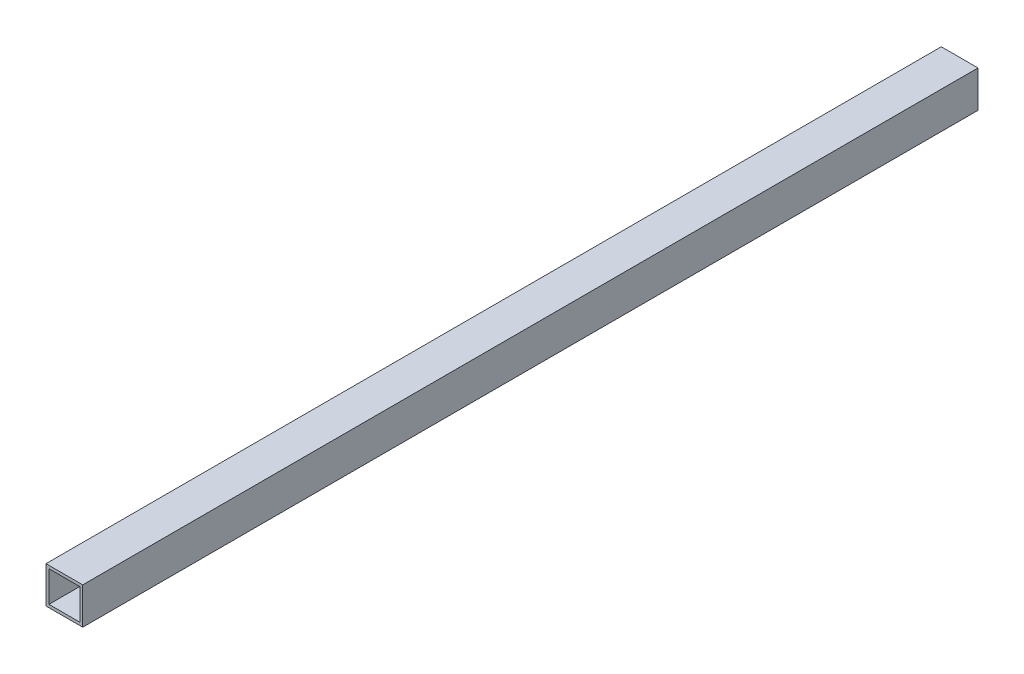
ISO-10303-21;
HEADER;
FILE_DESCRIPTION(('STEP AP214'),'2;1');
FILE_NAME('part.step','',(''),(''),'','','');
FILE_SCHEMA(('AUTOMOTIVE_DESIGN { 1 0 10303 214 1 1 1 1 }'));
ENDSEC;
DATA;
#1=APPLICATION_CONTEXT('core data for automotive mechanical design processes');
#2=APPLICATION_PROTOCOL_DEFINITION('international standard','automotive_design',2000,#1);
#3=PRODUCT_CONTEXT('',#1,'mechanical');
#4=PRODUCT('Part','Part','',(#3));
#5=PRODUCT_RELATED_PRODUCT_CATEGORY('part','',(#4));
#6=PRODUCT_DEFINITION_FORMATION('','',#4);
#7=PRODUCT_DEFINITION_CONTEXT('part definition',#1,'design');
#8=PRODUCT_DEFINITION('design','',#6,#7);
#9=PRODUCT_DEFINITION_SHAPE('','',#8);
#10=(LENGTH_UNIT() NAMED_UNIT(*) SI_UNIT(.MILLI.,.METRE.));
#11=(NAMED_UNIT(*) PLANE_ANGLE_UNIT() SI_UNIT($,.RADIAN.));
#12=(NAMED_UNIT(*) SI_UNIT($,.STERADIAN.) SOLID_ANGLE_UNIT());
#13=UNCERTAINTY_MEASURE_WITH_UNIT(LENGTH_MEASURE(1.E-05),#10,'distance_accuracy_value','');
#14=(GEOMETRIC_REPRESENTATION_CONTEXT(3) GLOBAL_UNCERTAINTY_ASSIGNED_CONTEXT((#13)) GLOBAL_UNIT_ASSIGNED_CONTEXT((#10,
#11,#12)) REPRESENTATION_CONTEXT('',''));
#15=CARTESIAN_POINT('',(0.,0.,0.));
#16=DIRECTION('',(0.,0.,1.));
#17=DIRECTION('',(1.,0.,0.));
#18=AXIS2_PLACEMENT_3D('',#15,#16,#17);
#19=CARTESIAN_POINT('',(0.,0.,304.8));
#20=DIRECTION('',(0.,0.,1.));
#21=DIRECTION('',(1.,0.,0.));
#22=AXIS2_PLACEMENT_3D('',#19,#20,#21);
#23=PLANE('',#22);
#24=DIRECTION('',(0.,1.,0.));
#25=VECTOR('',#24,1.);
#26=CARTESIAN_POINT('',(12.5,-12.5,304.8));
#27=LINE('',#26,#25);
#28=CARTESIAN_POINT('',(12.5,-12.5,304.8));
#29=VERTEX_POINT('',#28);
#30=CARTESIAN_POINT('',(12.5,12.5,304.8));
#31=VERTEX_POINT('',#30);
#32=EDGE_CURVE('E108',#29,#31,#27,.T.);
#33=ORIENTED_EDGE('',*,*,#32,.T.);
#34=DIRECTION('',(-1.,0.,0.));
#35=VECTOR('',#34,1.);
#36=CARTESIAN_POINT('',(12.5,12.5,304.8));
#37=LINE('',#36,#35);
#38=CARTESIAN_POINT('',(-12.5,12.5,304.8));
#39=VERTEX_POINT('',#38);
#40=EDGE_CURVE('E151',#31,#39,#37,.T.);
#41=ORIENTED_EDGE('',*,*,#40,.T.);
#42=DIRECTION('',(0.,-1.,0.));
#43=VECTOR('',#42,1.);
#44=CARTESIAN_POINT('',(-12.5,-12.5,304.8));
#45=LINE('',#44,#43);
#46=CARTESIAN_POINT('',(-12.5,-12.5,304.8));
#47=VERTEX_POINT('',#46);
#48=EDGE_CURVE('E153',#39,#47,#45,.T.);
#49=ORIENTED_EDGE('',*,*,#48,.T.);
#50=DIRECTION('',(1.,0.,0.));
#51=VECTOR('',#50,1.);
#52=CARTESIAN_POINT('',(12.5,-12.5,304.8));
#53=LINE('',#52,#51);
#54=EDGE_CURVE('E55',#47,#29,#53,.T.);
#55=ORIENTED_EDGE('',*,*,#54,.T.);
#56=EDGE_LOOP('',(#33,#41,#49,#55));
#57=FACE_BOUND('',#56,.T.);
#58=DIRECTION('',(-1.,0.,0.));
#59=VECTOR('',#58,1.);
#60=CARTESIAN_POINT('',(10.5,10.5,304.8));
#61=LINE('',#60,#59);
#62=CARTESIAN_POINT('',(10.5,10.5,304.8));
#63=VERTEX_POINT('',#62);
#64=CARTESIAN_POINT('',(-10.5,10.5,304.8));
#65=VERTEX_POINT('',#64);
#66=EDGE_CURVE('E140',#63,#65,#61,.T.);
#67=ORIENTED_EDGE('',*,*,#66,.F.);
#68=DIRECTION('',(0.,1.,0.));
#69=VECTOR('',#68,1.);
#70=CARTESIAN_POINT('',(10.5,-10.5,304.8));
#71=LINE('',#70,#69);
#72=CARTESIAN_POINT('',(10.5,-10.5,304.8));
#73=VERTEX_POINT('',#72);
#74=EDGE_CURVE('E105',#73,#63,#71,.T.);
#75=ORIENTED_EDGE('',*,*,#74,.F.);
#76=DIRECTION('',(1.,0.,0.));
#77=VECTOR('',#76,1.);
#78=CARTESIAN_POINT('',(10.5,-10.5,304.8));
#79=LINE('',#78,#77);
#80=CARTESIAN_POINT('',(-10.5,-10.5,304.8));
#81=VERTEX_POINT('',#80);
#82=EDGE_CURVE('E144',#81,#73,#79,.T.);
#83=ORIENTED_EDGE('',*,*,#82,.F.);
#84=DIRECTION('',(0.,-1.,0.));
#85=VECTOR('',#84,1.);
#86=CARTESIAN_POINT('',(-10.5,-10.5,304.8));
#87=LINE('',#86,#85);
#88=EDGE_CURVE('E142',#65,#81,#87,.T.);
#89=ORIENTED_EDGE('',*,*,#88,.F.);
#90=EDGE_LOOP('',(#67,#75,#83,#89));
#91=FACE_BOUND('',#90,.T.);
#92=ADVANCED_FACE('F32',(#57,#91),#23,.T.);
#93=CARTESIAN_POINT('',(12.5,-12.5,304.8));
#94=DIRECTION('',(-1.,0.,0.));
#95=DIRECTION('',(0.,0.,1.));
#96=AXIS2_PLACEMENT_3D('',#93,#94,#95);
#97=PLANE('',#96);
#98=DIRECTION('',(0.,0.,-1.));
#99=VECTOR('',#98,1.);
#100=CARTESIAN_POINT('',(12.5,-12.5,304.8));
#101=LINE('',#100,#99);
#102=CARTESIAN_POINT('',(12.5,-12.5,-304.8));
#103=VERTEX_POINT('',#102);
#104=EDGE_CURVE('E156',#29,#103,#101,.T.);
#105=ORIENTED_EDGE('',*,*,#104,.T.);
#106=DIRECTION('',(0.,1.,0.));
#107=VECTOR('',#106,1.);
#108=CARTESIAN_POINT('',(12.5,-12.5,-304.8));
#109=LINE('',#108,#107);
#110=CARTESIAN_POINT('',(12.5,12.5,-304.8));
#111=VERTEX_POINT('',#110);
#112=EDGE_CURVE('E127',#103,#111,#109,.T.);
#113=ORIENTED_EDGE('',*,*,#112,.T.);
#114=DIRECTION('',(0.,0.,-1.));
#115=VECTOR('',#114,1.);
#116=CARTESIAN_POINT('',(12.5,12.5,304.8));
#117=LINE('',#116,#115);
#118=EDGE_CURVE('E11',#31,#111,#117,.T.);
#119=ORIENTED_EDGE('',*,*,#118,.F.);
#120=ORIENTED_EDGE('',*,*,#32,.F.);
#121=EDGE_LOOP('',(#105,#113,#119,#120));
#122=FACE_BOUND('',#121,.T.);
#123=ADVANCED_FACE('F34',(#122),#97,.F.);
#124=CARTESIAN_POINT('',(12.5,12.5,304.8));
#125=DIRECTION('',(0.,-1.,0.));
#126=DIRECTION('',(1.,0.,0.));
#127=AXIS2_PLACEMENT_3D('',#124,#125,#126);
#128=PLANE('',#127);
#129=ORIENTED_EDGE('',*,*,#118,.T.);
#130=DIRECTION('',(-1.,0.,0.));
#131=VECTOR('',#130,1.);
#132=CARTESIAN_POINT('',(12.5,12.5,-304.8));
#133=LINE('',#132,#131);
#134=CARTESIAN_POINT('',(-12.5,12.5,-304.8));
#135=VERTEX_POINT('',#134);
#136=EDGE_CURVE('E130',#111,#135,#133,.T.);
#137=ORIENTED_EDGE('',*,*,#136,.T.);
#138=DIRECTION('',(0.,0.,-1.));
#139=VECTOR('',#138,1.);
#140=CARTESIAN_POINT('',(-12.5,12.5,304.8));
#141=LINE('',#140,#139);
#142=EDGE_CURVE('E40',#39,#135,#141,.T.);
#143=ORIENTED_EDGE('',*,*,#142,.F.);
#144=ORIENTED_EDGE('',*,*,#40,.F.);
#145=EDGE_LOOP('',(#129,#137,#143,#144));
#146=FACE_BOUND('',#145,.T.);
#147=ADVANCED_FACE('F169',(#146),#128,.F.);
#148=CARTESIAN_POINT('',(-12.5,-12.5,304.8));
#149=DIRECTION('',(1.,0.,0.));
#150=DIRECTION('',(0.,0.,-1.));
#151=AXIS2_PLACEMENT_3D('',#148,#149,#150);
#152=PLANE('',#151);
#153=ORIENTED_EDGE('',*,*,#142,.T.);
#154=DIRECTION('',(0.,-1.,0.));
#155=VECTOR('',#154,1.);
#156=CARTESIAN_POINT('',(-12.5,-12.5,-304.8));
#157=LINE('',#156,#155);
#158=CARTESIAN_POINT('',(-12.5,-12.5,-304.8));
#159=VERTEX_POINT('',#158);
#160=EDGE_CURVE('E133',#135,#159,#157,.T.);
#161=ORIENTED_EDGE('',*,*,#160,.T.);
#162=DIRECTION('',(0.,0.,-1.));
#163=VECTOR('',#162,1.);
#164=CARTESIAN_POINT('',(-12.5,-12.5,304.8));
#165=LINE('',#164,#163);
#166=EDGE_CURVE('E158',#47,#159,#165,.T.);
#167=ORIENTED_EDGE('',*,*,#166,.F.);
#168=ORIENTED_EDGE('',*,*,#48,.F.);
#169=EDGE_LOOP('',(#153,#161,#167,#168));
#170=FACE_BOUND('',#169,.T.);
#171=ADVANCED_FACE('F163',(#170),#152,.F.);
#172=CARTESIAN_POINT('',(12.5,-12.5,304.8));
#173=DIRECTION('',(0.,1.,0.));
#174=DIRECTION('',(-1.,0.,0.));
#175=AXIS2_PLACEMENT_3D('',#172,#173,#174);
#176=PLANE('',#175);
#177=ORIENTED_EDGE('',*,*,#166,.T.);
#178=DIRECTION('',(1.,0.,0.));
#179=VECTOR('',#178,1.);
#180=CARTESIAN_POINT('',(12.5,-12.5,-304.8));
#181=LINE('',#180,#179);
#182=EDGE_CURVE('E136',#159,#103,#181,.T.);
#183=ORIENTED_EDGE('',*,*,#182,.T.);
#184=ORIENTED_EDGE('',*,*,#104,.F.);
#185=ORIENTED_EDGE('',*,*,#54,.F.);
#186=EDGE_LOOP('',(#177,#183,#184,#185));
#187=FACE_BOUND('',#186,.T.);
#188=ADVANCED_FACE('F174',(#187),#176,.F.);
#189=CARTESIAN_POINT('',(10.5,-10.5,304.8));
#190=DIRECTION('',(-1.,0.,0.));
#191=DIRECTION('',(0.,0.,1.));
#192=AXIS2_PLACEMENT_3D('',#189,#190,#191);
#193=PLANE('',#192);
#194=DIRECTION('',(0.,0.,-1.));
#195=VECTOR('',#194,1.);
#196=CARTESIAN_POINT('',(10.5,10.5,304.8));
#197=LINE('',#196,#195);
#198=CARTESIAN_POINT('',(10.5,10.5,-304.8));
#199=VERTEX_POINT('',#198);
#200=EDGE_CURVE('E97',#63,#199,#197,.T.);
#201=ORIENTED_EDGE('',*,*,#200,.T.);
#202=DIRECTION('',(0.,1.,0.));
#203=VECTOR('',#202,1.);
#204=CARTESIAN_POINT('',(10.5,-10.5,-304.8));
#205=LINE('',#204,#203);
#206=CARTESIAN_POINT('',(10.5,-10.5,-304.8));
#207=VERTEX_POINT('',#206);
#208=EDGE_CURVE('E102',#207,#199,#205,.T.);
#209=ORIENTED_EDGE('',*,*,#208,.F.);
#210=DIRECTION('',(0.,0.,-1.));
#211=VECTOR('',#210,1.);
#212=CARTESIAN_POINT('',(10.5,-10.5,304.8));
#213=LINE('',#212,#211);
#214=EDGE_CURVE('E146',#73,#207,#213,.T.);
#215=ORIENTED_EDGE('',*,*,#214,.F.);
#216=ORIENTED_EDGE('',*,*,#74,.T.);
#217=EDGE_LOOP('',(#201,#209,#215,#216));
#218=FACE_BOUND('',#217,.T.);
#219=ADVANCED_FACE('F99',(#218),#193,.T.);
#220=CARTESIAN_POINT('',(10.5,10.5,304.8));
#221=DIRECTION('',(0.,-1.,0.));
#222=DIRECTION('',(1.,0.,0.));
#223=AXIS2_PLACEMENT_3D('',#220,#221,#222);
#224=PLANE('',#223);
#225=DIRECTION('',(0.,0.,-1.));
#226=VECTOR('',#225,1.);
#227=CARTESIAN_POINT('',(-10.5,10.5,304.8));
#228=LINE('',#227,#226);
#229=CARTESIAN_POINT('',(-10.5,10.5,-304.8));
#230=VERTEX_POINT('',#229);
#231=EDGE_CURVE('E109',#65,#230,#228,.T.);
#232=ORIENTED_EDGE('',*,*,#231,.T.);
#233=DIRECTION('',(-1.,0.,0.));
#234=VECTOR('',#233,1.);
#235=CARTESIAN_POINT('',(10.5,10.5,-304.8));
#236=LINE('',#235,#234);
#237=EDGE_CURVE('E112',#199,#230,#236,.T.);
#238=ORIENTED_EDGE('',*,*,#237,.F.);
#239=ORIENTED_EDGE('',*,*,#200,.F.);
#240=ORIENTED_EDGE('',*,*,#66,.T.);
#241=EDGE_LOOP('',(#232,#238,#239,#240));
#242=FACE_BOUND('',#241,.T.);
#243=ADVANCED_FACE('F113',(#242),#224,.T.);
#244=CARTESIAN_POINT('',(-10.5,-10.5,304.8));
#245=DIRECTION('',(1.,0.,0.));
#246=DIRECTION('',(0.,0.,-1.));
#247=AXIS2_PLACEMENT_3D('',#244,#245,#246);
#248=PLANE('',#247);
#249=DIRECTION('',(0.,0.,-1.));
#250=VECTOR('',#249,1.);
#251=CARTESIAN_POINT('',(-10.5,-10.5,304.8));
#252=LINE('',#251,#250);
#253=CARTESIAN_POINT('',(-10.5,-10.5,-304.8));
#254=VERTEX_POINT('',#253);
#255=EDGE_CURVE('E47',#81,#254,#252,.T.);
#256=ORIENTED_EDGE('',*,*,#255,.T.);
#257=DIRECTION('',(0.,-1.,0.));
#258=VECTOR('',#257,1.);
#259=CARTESIAN_POINT('',(-10.5,-10.5,-304.8));
#260=LINE('',#259,#258);
#261=EDGE_CURVE('E118',#230,#254,#260,.T.);
#262=ORIENTED_EDGE('',*,*,#261,.F.);
#263=ORIENTED_EDGE('',*,*,#231,.F.);
#264=ORIENTED_EDGE('',*,*,#88,.T.);
#265=EDGE_LOOP('',(#256,#262,#263,#264));
#266=FACE_BOUND('',#265,.T.);
#267=ADVANCED_FACE('F192',(#266),#248,.T.);
#268=CARTESIAN_POINT('',(10.5,-10.5,304.8));
#269=DIRECTION('',(0.,1.,0.));
#270=DIRECTION('',(-1.,0.,0.));
#271=AXIS2_PLACEMENT_3D('',#268,#269,#270);
#272=PLANE('',#271);
#273=ORIENTED_EDGE('',*,*,#214,.T.);
#274=DIRECTION('',(1.,0.,0.));
#275=VECTOR('',#274,1.);
#276=CARTESIAN_POINT('',(10.5,-10.5,-304.8));
#277=LINE('',#276,#275);
#278=EDGE_CURVE('E122',#254,#207,#277,.T.);
#279=ORIENTED_EDGE('',*,*,#278,.F.);
#280=ORIENTED_EDGE('',*,*,#255,.F.);
#281=ORIENTED_EDGE('',*,*,#82,.T.);
#282=EDGE_LOOP('',(#273,#279,#280,#281));
#283=FACE_BOUND('',#282,.T.);
#284=ADVANCED_FACE('F195',(#283),#272,.T.);
#285=CARTESIAN_POINT('',(0.,0.,-304.8));
#286=DIRECTION('',(0.,0.,1.));
#287=DIRECTION('',(1.,0.,0.));
#288=AXIS2_PLACEMENT_3D('',#285,#286,#287);
#289=PLANE('',#288);
#290=ORIENTED_EDGE('',*,*,#278,.T.);
#291=ORIENTED_EDGE('',*,*,#208,.T.);
#292=ORIENTED_EDGE('',*,*,#237,.T.);
#293=ORIENTED_EDGE('',*,*,#261,.T.);
#294=EDGE_LOOP('',(#290,#291,#292,#293));
#295=FACE_BOUND('',#294,.T.);
#296=ORIENTED_EDGE('',*,*,#112,.F.);
#297=ORIENTED_EDGE('',*,*,#182,.F.);
#298=ORIENTED_EDGE('',*,*,#160,.F.);
#299=ORIENTED_EDGE('',*,*,#136,.F.);
#300=EDGE_LOOP('',(#296,#297,#298,#299));
#301=FACE_BOUND('',#300,.T.);
#302=ADVANCED_FACE('F120',(#295,#301),#289,.F.);
#303=CLOSED_SHELL('',(#92,#123,#147,#171,#188,#219,#243,#267,#284,#302));
#304=MANIFOLD_SOLID_BREP('B2',#303);
#305=ADVANCED_BREP_SHAPE_REPRESENTATION('',(#18,#304),#14);
#306=SHAPE_DEFINITION_REPRESENTATION(#9,#305);
ENDSEC;
END-ISO-10303-21;
